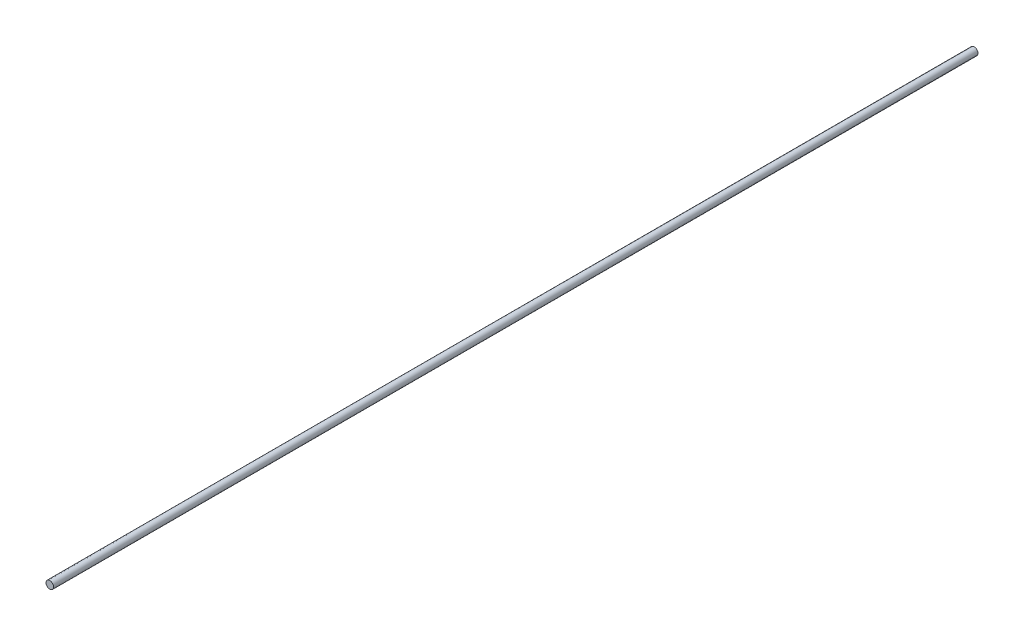
ISO-10303-21;
HEADER;
FILE_DESCRIPTION(('STEP AP214'),'2;1');
FILE_NAME('part.step','',(''),(''),'','','');
FILE_SCHEMA(('AUTOMOTIVE_DESIGN { 1 0 10303 214 1 1 1 1 }'));
ENDSEC;
DATA;
#1=APPLICATION_CONTEXT('core data for automotive mechanical design processes');
#2=APPLICATION_PROTOCOL_DEFINITION('international standard','automotive_design',2000,#1);
#3=PRODUCT_CONTEXT('',#1,'mechanical');
#4=PRODUCT('Part','Part','',(#3));
#5=PRODUCT_RELATED_PRODUCT_CATEGORY('part','',(#4));
#6=PRODUCT_DEFINITION_FORMATION('','',#4);
#7=PRODUCT_DEFINITION_CONTEXT('part definition',#1,'design');
#8=PRODUCT_DEFINITION('design','',#6,#7);
#9=PRODUCT_DEFINITION_SHAPE('','',#8);
#10=(LENGTH_UNIT() NAMED_UNIT(*) SI_UNIT(.MILLI.,.METRE.));
#11=(NAMED_UNIT(*) PLANE_ANGLE_UNIT() SI_UNIT($,.RADIAN.));
#12=(NAMED_UNIT(*) SI_UNIT($,.STERADIAN.) SOLID_ANGLE_UNIT());
#13=UNCERTAINTY_MEASURE_WITH_UNIT(LENGTH_MEASURE(1.E-05),#10,'distance_accuracy_value','');
#14=(GEOMETRIC_REPRESENTATION_CONTEXT(3) GLOBAL_UNCERTAINTY_ASSIGNED_CONTEXT((#13)) GLOBAL_UNIT_ASSIGNED_CONTEXT((#10,
#11,#12)) REPRESENTATION_CONTEXT('',''));
#15=CARTESIAN_POINT('',(0.,0.,0.));
#16=DIRECTION('',(0.,0.,1.));
#17=DIRECTION('',(1.,0.,0.));
#18=AXIS2_PLACEMENT_3D('',#15,#16,#17);
#19=CARTESIAN_POINT('',(0.,0.,-609.6));
#20=DIRECTION('',(0.,0.,1.));
#21=DIRECTION('',(1.,0.,0.));
#22=AXIS2_PLACEMENT_3D('',#19,#20,#21);
#23=CYLINDRICAL_SURFACE('',#22,2.5);
#24=CARTESIAN_POINT('',(0.,0.,-609.6));
#25=DIRECTION('',(0.,0.,1.));
#26=DIRECTION('',(1.,0.,0.));
#27=AXIS2_PLACEMENT_3D('',#24,#25,#26);
#28=CIRCLE('',#27,2.5);
#29=CARTESIAN_POINT('',(2.5,0.,-609.6));
#30=VERTEX_POINT('',#29);
#31=EDGE_CURVE('E10',#30,#30,#28,.T.);
#32=CARTESIAN_POINT('',(0.,0.,0.));
#33=DIRECTION('',(0.,0.,1.));
#34=DIRECTION('',(1.,0.,0.));
#35=AXIS2_PLACEMENT_3D('',#32,#33,#34);
#36=CIRCLE('',#35,2.5);
#37=CARTESIAN_POINT('',(2.5,0.,0.));
#38=VERTEX_POINT('',#37);
#39=EDGE_CURVE('E36',#38,#38,#36,.T.);
#40=CARTESIAN_POINT('',(2.5,0.,-609.6));
#41=CARTESIAN_POINT('',(2.5,0.,-603.25));
#42=CARTESIAN_POINT('',(2.5,0.,-596.9));
#43=CARTESIAN_POINT('',(2.5,0.,-584.2));
#44=CARTESIAN_POINT('',(2.5,0.,-577.85));
#45=CARTESIAN_POINT('',(2.5,0.,-565.15));
#46=CARTESIAN_POINT('',(2.5,0.,-558.8));
#47=CARTESIAN_POINT('',(2.5,0.,-546.1));
#48=CARTESIAN_POINT('',(2.5,0.,-539.75));
#49=CARTESIAN_POINT('',(2.5,0.,-527.05));
#50=CARTESIAN_POINT('',(2.5,0.,-520.7));
#51=CARTESIAN_POINT('',(2.5,0.,-508.));
#52=CARTESIAN_POINT('',(2.5,0.,-501.65));
#53=CARTESIAN_POINT('',(2.5,0.,-488.95));
#54=CARTESIAN_POINT('',(2.5,0.,-482.6));
#55=CARTESIAN_POINT('',(2.5,0.,-469.9));
#56=CARTESIAN_POINT('',(2.5,0.,-463.55));
#57=CARTESIAN_POINT('',(2.5,0.,-450.85));
#58=CARTESIAN_POINT('',(2.5,0.,-444.5));
#59=CARTESIAN_POINT('',(2.5,0.,-431.8));
#60=CARTESIAN_POINT('',(2.5,0.,-425.45));
#61=CARTESIAN_POINT('',(2.5,0.,-412.75));
#62=CARTESIAN_POINT('',(2.5,0.,-406.4));
#63=CARTESIAN_POINT('',(2.5,0.,-393.7));
#64=CARTESIAN_POINT('',(2.5,0.,-387.35));
#65=CARTESIAN_POINT('',(2.5,0.,-374.65));
#66=CARTESIAN_POINT('',(2.5,0.,-368.3));
#67=CARTESIAN_POINT('',(2.5,0.,-355.6));
#68=CARTESIAN_POINT('',(2.5,0.,-349.25));
#69=CARTESIAN_POINT('',(2.5,0.,-336.55));
#70=CARTESIAN_POINT('',(2.5,0.,-330.2));
#71=CARTESIAN_POINT('',(2.5,0.,-317.5));
#72=CARTESIAN_POINT('',(2.5,0.,-311.15));
#73=CARTESIAN_POINT('',(2.5,0.,-298.45));
#74=CARTESIAN_POINT('',(2.5,0.,-292.1));
#75=CARTESIAN_POINT('',(2.5,0.,-279.4));
#76=CARTESIAN_POINT('',(2.5,0.,-273.05));
#77=CARTESIAN_POINT('',(2.5,0.,-260.35));
#78=CARTESIAN_POINT('',(2.5,0.,-254.));
#79=CARTESIAN_POINT('',(2.5,0.,-241.3));
#80=CARTESIAN_POINT('',(2.5,0.,-234.95));
#81=CARTESIAN_POINT('',(2.5,0.,-222.25));
#82=CARTESIAN_POINT('',(2.5,0.,-215.9));
#83=CARTESIAN_POINT('',(2.5,0.,-203.2));
#84=CARTESIAN_POINT('',(2.5,0.,-196.85));
#85=CARTESIAN_POINT('',(2.5,0.,-184.15));
#86=CARTESIAN_POINT('',(2.5,0.,-177.8));
#87=CARTESIAN_POINT('',(2.5,0.,-165.1));
#88=CARTESIAN_POINT('',(2.5,0.,-158.75));
#89=CARTESIAN_POINT('',(2.5,0.,-146.05));
#90=CARTESIAN_POINT('',(2.5,0.,-139.7));
#91=CARTESIAN_POINT('',(2.5,0.,-127.));
#92=CARTESIAN_POINT('',(2.5,0.,-120.65));
#93=CARTESIAN_POINT('',(2.5,0.,-107.95));
#94=CARTESIAN_POINT('',(2.5,0.,-101.6));
#95=CARTESIAN_POINT('',(2.5,0.,-88.9));
#96=CARTESIAN_POINT('',(2.5,0.,-82.5500000000001));
#97=CARTESIAN_POINT('',(2.5,0.,-69.85));
#98=CARTESIAN_POINT('',(2.5,0.,-63.5));
#99=CARTESIAN_POINT('',(2.5,0.,-50.8));
#100=CARTESIAN_POINT('',(2.5,0.,-44.45));
#101=CARTESIAN_POINT('',(2.5,0.,-31.75));
#102=CARTESIAN_POINT('',(2.5,0.,-25.4));
#103=CARTESIAN_POINT('',(2.5,0.,-12.7));
#104=CARTESIAN_POINT('',(2.5,0.,-6.35000000000001));
#105=CARTESIAN_POINT('',(2.5,0.,0.));
#106=B_SPLINE_CURVE_WITH_KNOTS('',3,(#40,#41,#42,#43,#44,#45,#46,#47,#48,#49,#50,#51,#52,#53,
#54,#55,#56,#57,#58,#59,#60,#61,#62,#63,#64,#65,#66,#67,#68,#69,#70,#71,#72,#73,#74,#75,#76,#77,
#78,#79,#80,#81,#82,#83,#84,#85,#86,#87,#88,#89,#90,#91,#92,#93,#94,#95,#96,#97,#98,#99,#100,
#101,#102,#103,#104,#105),.UNSPECIFIED.,.F.,.F.,(4,2,2,2,2,2,2,2,2,2,2,2,2,2,2,2,2,2,2,2,2,2,2,
2,2,2,2,2,2,2,2,2,4),(0.,19.05,38.1,57.15,76.2,95.2500000000001,114.3,133.35,152.4,171.45,190.5,
209.55,228.6,247.65,266.7,285.75,304.8,323.85,342.9,361.95,381.,400.05,419.1,438.15,457.2,
476.25,495.3,514.35,533.4,552.45,571.5,590.55,609.6),.UNSPECIFIED.);
#107=EDGE_CURVE('BSEAM33',#30,#38,#106,.T.);
#108=ORIENTED_EDGE('',*,*,#31,.T.);
#109=ORIENTED_EDGE('',*,*,#39,.F.);
#110=ORIENTED_EDGE('',*,*,#107,.T.);
#111=ORIENTED_EDGE('',*,*,#107,.F.);
#112=EDGE_LOOP('',(#108,#110,#109,#111));
#113=FACE_BOUND('',#112,.T.);
#114=ADVANCED_FACE('F33',(#113),#23,.T.);
#115=CARTESIAN_POINT('',(0.,0.,-609.6));
#116=DIRECTION('',(0.,0.,1.));
#117=DIRECTION('',(1.,0.,0.));
#118=AXIS2_PLACEMENT_3D('',#115,#116,#117);
#119=PLANE('',#118);
#120=ORIENTED_EDGE('',*,*,#31,.F.);
#121=EDGE_LOOP('',(#120));
#122=FACE_BOUND('',#121,.T.);
#123=ADVANCED_FACE('F48',(#122),#119,.F.);
#124=CARTESIAN_POINT('',(0.,0.,0.));
#125=DIRECTION('',(0.,0.,1.));
#126=DIRECTION('',(1.,0.,0.));
#127=AXIS2_PLACEMENT_3D('',#124,#125,#126);
#128=PLANE('',#127);
#129=ORIENTED_EDGE('',*,*,#39,.T.);
#130=EDGE_LOOP('',(#129));
#131=FACE_BOUND('',#130,.T.);
#132=ADVANCED_FACE('F45',(#131),#128,.T.);
#133=CLOSED_SHELL('',(#114,#123,#132));
#134=MANIFOLD_SOLID_BREP('B2',#133);
#135=ADVANCED_BREP_SHAPE_REPRESENTATION('',(#18,#134),#14);
#136=SHAPE_DEFINITION_REPRESENTATION(#9,#135);
ENDSEC;
END-ISO-10303-21;
